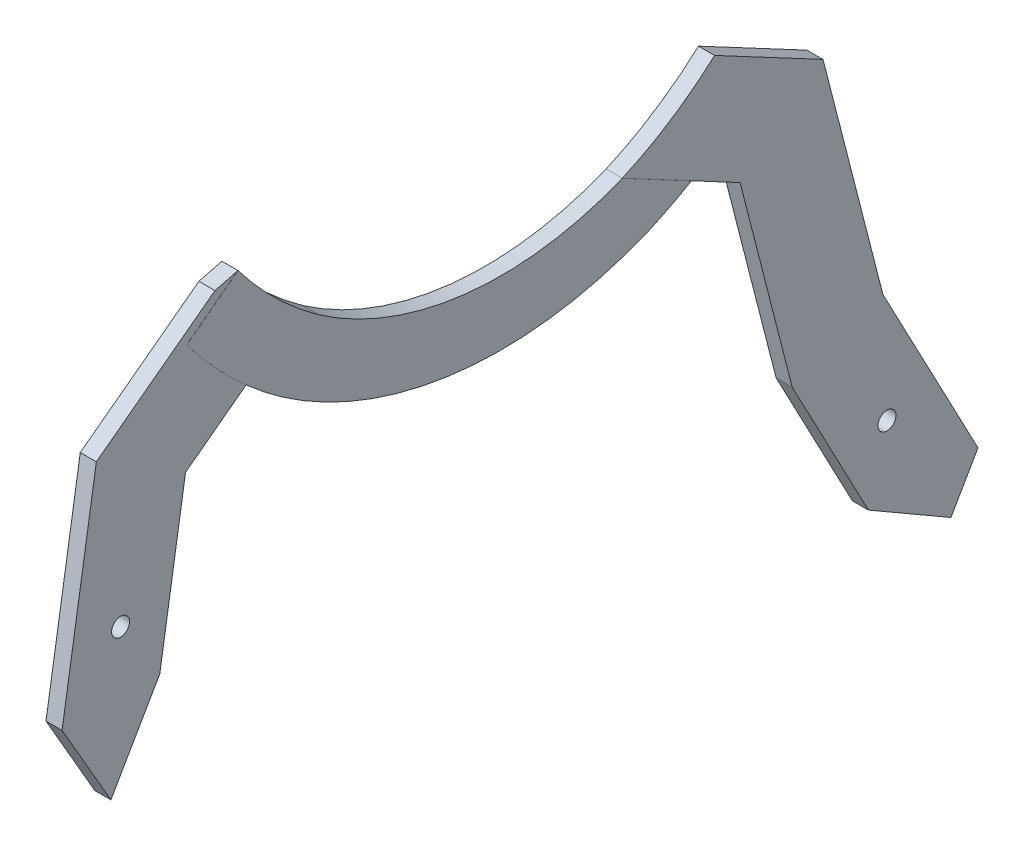
ISO-10303-21;
HEADER;
FILE_DESCRIPTION(('STEP AP214'),'2;1');
FILE_NAME('part.step','',(''),(''),'','','');
FILE_SCHEMA(('AUTOMOTIVE_DESIGN { 1 0 10303 214 1 1 1 1 }'));
ENDSEC;
DATA;
#1=APPLICATION_CONTEXT('core data for automotive mechanical design processes');
#2=APPLICATION_PROTOCOL_DEFINITION('international standard','automotive_design',2000,#1);
#3=PRODUCT_CONTEXT('',#1,'mechanical');
#4=PRODUCT('Part','Part','',(#3));
#5=PRODUCT_RELATED_PRODUCT_CATEGORY('part','',(#4));
#6=PRODUCT_DEFINITION_FORMATION('','',#4);
#7=PRODUCT_DEFINITION_CONTEXT('part definition',#1,'design');
#8=PRODUCT_DEFINITION('design','',#6,#7);
#9=PRODUCT_DEFINITION_SHAPE('','',#8);
#10=(LENGTH_UNIT() NAMED_UNIT(*) SI_UNIT(.MILLI.,.METRE.));
#11=(NAMED_UNIT(*) PLANE_ANGLE_UNIT() SI_UNIT($,.RADIAN.));
#12=(NAMED_UNIT(*) SI_UNIT($,.STERADIAN.) SOLID_ANGLE_UNIT());
#13=UNCERTAINTY_MEASURE_WITH_UNIT(LENGTH_MEASURE(1.E-05),#10,'distance_accuracy_value','');
#14=(GEOMETRIC_REPRESENTATION_CONTEXT(3) GLOBAL_UNCERTAINTY_ASSIGNED_CONTEXT((#13)) GLOBAL_UNIT_ASSIGNED_CONTEXT((#10,
#11,#12)) REPRESENTATION_CONTEXT('',''));
#15=CARTESIAN_POINT('',(0.,0.,0.));
#16=DIRECTION('',(0.,0.,1.));
#17=DIRECTION('',(1.,0.,0.));
#18=AXIS2_PLACEMENT_3D('',#15,#16,#17);
#19=CARTESIAN_POINT('',(-75.565,380.330006427415,-74.6248454772468));
#20=DIRECTION('',(0.,-0.466497855674576,0.884522329085605));
#21=DIRECTION('',(0.,0.884522329085605,0.466497855674576));
#22=AXIS2_PLACEMENT_3D('',#19,#20,#21);
#23=PLANE('',#22);
#24=DIRECTION('',(-1.,0.,0.));
#25=VECTOR('',#24,1.);
#26=CARTESIAN_POINT('',(-77.94625,380.595490592497,-74.4848288946752));
#27=LINE('',#26,#25);
#28=CARTESIAN_POINT('',(-76.35875,380.595490592497,-74.4848288946752));
#29=VERTEX_POINT('',#28);
#30=CARTESIAN_POINT('',(-79.53375,380.595490592497,-74.4848288946752));
#31=VERTEX_POINT('',#30);
#32=EDGE_CURVE('E11',#29,#31,#27,.T.);
#33=ORIENTED_EDGE('',*,*,#32,.T.);
#34=DIRECTION('',(0.,-0.884522329085605,-0.466497855674576));
#35=VECTOR('',#34,1.);
#36=CARTESIAN_POINT('',(-79.53375,343.459429906962,-94.0704200192228));
#37=LINE('',#36,#35);
#38=CARTESIAN_POINT('',(-79.53375,416.198358171535,-55.7078451653261));
#39=VERTEX_POINT('',#38);
#40=EDGE_CURVE('E25',#39,#31,#37,.T.);
#41=ORIENTED_EDGE('',*,*,#40,.F.);
#42=DIRECTION('',(-1.,0.,0.));
#43=VECTOR('',#42,1.);
#44=CARTESIAN_POINT('',(-75.565,416.198358171535,-55.7078451653261));
#45=LINE('',#44,#43);
#46=CARTESIAN_POINT('',(-76.35875,416.198358171535,-55.7078451653261));
#47=VERTEX_POINT('',#46);
#48=EDGE_CURVE('E512',#47,#39,#45,.T.);
#49=ORIENTED_EDGE('',*,*,#48,.F.);
#50=DIRECTION('',(0.,-0.884522329085605,-0.466497855674576));
#51=VECTOR('',#50,1.);
#52=CARTESIAN_POINT('',(-76.35875,343.459429906962,-94.0704200192228));
#53=LINE('',#52,#51);
#54=EDGE_CURVE('E508',#47,#29,#53,.T.);
#55=ORIENTED_EDGE('',*,*,#54,.T.);
#56=EDGE_LOOP('',(#33,#41,#49,#55));
#57=FACE_BOUND('',#56,.T.);
#58=ADVANCED_FACE('F17',(#57),#23,.F.);
#59=CARTESIAN_POINT('',(-75.565,416.198358171535,-55.7078451653261));
#60=DIRECTION('',(0.,-0.248375350267703,0.968663866044045));
#61=DIRECTION('',(0.,0.968663866044045,0.248375350267703));
#62=AXIS2_PLACEMENT_3D('',#59,#60,#61);
#63=PLANE('',#62);
#64=DIRECTION('',(0.,-0.968663866044045,-0.248375350267703));
#65=VECTOR('',#64,1.);
#66=CARTESIAN_POINT('',(-76.35875,343.58610343933,-74.3263720197377));
#67=LINE('',#66,#65);
#68=CARTESIAN_POINT('',(-76.35875,462.29314042173,-43.8886702293783));
#69=VERTEX_POINT('',#68);
#70=EDGE_CURVE('E503',#69,#47,#67,.T.);
#71=ORIENTED_EDGE('',*,*,#70,.T.);
#72=ORIENTED_EDGE('',*,*,#48,.T.);
#73=DIRECTION('',(0.,-0.968663866044045,-0.248375350267703));
#74=VECTOR('',#73,1.);
#75=CARTESIAN_POINT('',(-79.53375,343.58610343933,-74.3263720197377));
#76=LINE('',#75,#74);
#77=CARTESIAN_POINT('',(-79.53375,462.29314042173,-43.8886702293783));
#78=VERTEX_POINT('',#77);
#79=EDGE_CURVE('E498',#78,#39,#76,.T.);
#80=ORIENTED_EDGE('',*,*,#79,.F.);
#81=DIRECTION('',(-1.,0.,0.));
#82=VECTOR('',#81,1.);
#83=CARTESIAN_POINT('',(-75.565,462.29314042173,-43.8886702293783));
#84=LINE('',#83,#82);
#85=EDGE_CURVE('E495',#69,#78,#84,.T.);
#86=ORIENTED_EDGE('',*,*,#85,.F.);
#87=EDGE_LOOP('',(#71,#72,#80,#86));
#88=FACE_BOUND('',#87,.T.);
#89=ADVANCED_FACE('F524',(#88),#63,.F.);
#90=CARTESIAN_POINT('',(-75.565,462.29314042173,-43.8886702293783));
#91=DIRECTION('',(0.,-0.882970965785958,0.46942760206342));
#92=DIRECTION('',(0.,0.46942760206342,0.882970965785958));
#93=AXIS2_PLACEMENT_3D('',#90,#91,#92);
#94=PLANE('',#93);
#95=DIRECTION('',(1.,0.,0.));
#96=VECTOR('',#95,1.);
#97=CARTESIAN_POINT('',(-80.3275,473.66616999466,-22.4965431755355));
#98=LINE('',#97,#96);
#99=CARTESIAN_POINT('',(-79.53375,473.66616999466,-22.4965431755355));
#100=VERTEX_POINT('',#99);
#101=CARTESIAN_POINT('',(-76.35875,473.66616999466,-22.4965431755355));
#102=VERTEX_POINT('',#101);
#103=EDGE_CURVE('E491',#100,#102,#98,.T.);
#104=ORIENTED_EDGE('',*,*,#103,.T.);
#105=DIRECTION('',(0.,-0.46942760206342,-0.882970965785958));
#106=VECTOR('',#105,1.);
#107=CARTESIAN_POINT('',(-76.35875,447.404906403868,-71.8927294534514));
#108=LINE('',#107,#106);
#109=EDGE_CURVE('E486',#102,#69,#108,.T.);
#110=ORIENTED_EDGE('',*,*,#109,.T.);
#111=ORIENTED_EDGE('',*,*,#85,.T.);
#112=DIRECTION('',(0.,-0.46942760206342,-0.882970965785958));
#113=VECTOR('',#112,1.);
#114=CARTESIAN_POINT('',(-79.53375,447.404906403868,-71.8927294534514));
#115=LINE('',#114,#113);
#116=EDGE_CURVE('E481',#100,#78,#115,.T.);
#117=ORIENTED_EDGE('',*,*,#116,.F.);
#118=EDGE_LOOP('',(#104,#110,#111,#117));
#119=FACE_BOUND('',#118,.T.);
#120=ADVANCED_FACE('F526',(#119),#94,.F.);
#121=CARTESIAN_POINT('',(-75.565,449.418698704968,-27.5235444258966));
#122=DIRECTION('',(0.,0.248375350267703,-0.968663866044045));
#123=DIRECTION('',(0.,-0.968663866044045,-0.248375350267703));
#124=AXIS2_PLACEMENT_3D('',#121,#122,#123);
#125=PLANE('',#124);
#126=DIRECTION('',(0.,0.968663866044045,0.248375350267703));
#127=VECTOR('',#126,1.);
#128=CARTESIAN_POINT('',(-76.35875,357.830498494747,-51.0076983259533));
#129=LINE('',#128,#127);
#130=CARTESIAN_POINT('',(-76.35875,409.294859361956,-37.811708360002));
#131=VERTEX_POINT('',#130);
#132=CARTESIAN_POINT('',(-76.35875,449.418698704969,-27.5235444258966));
#133=VERTEX_POINT('',#132);
#134=EDGE_CURVE('E479',#131,#133,#129,.T.);
#135=ORIENTED_EDGE('',*,*,#134,.T.);
#136=DIRECTION('',(-1.,0.,0.));
#137=VECTOR('',#136,1.);
#138=CARTESIAN_POINT('',(-75.565,449.418698704969,-27.5235444258963));
#139=LINE('',#138,#137);
#140=CARTESIAN_POINT('',(-79.53375,449.418698704969,-27.5235444258966));
#141=VERTEX_POINT('',#140);
#142=EDGE_CURVE('E475',#133,#141,#139,.T.);
#143=ORIENTED_EDGE('',*,*,#142,.T.);
#144=DIRECTION('',(0.,0.968663866044045,0.248375350267703));
#145=VECTOR('',#144,1.);
#146=CARTESIAN_POINT('',(-79.53375,357.830498494747,-51.0076983259533));
#147=LINE('',#146,#145);
#148=CARTESIAN_POINT('',(-79.53375,409.294859361956,-37.811708360002));
#149=VERTEX_POINT('',#148);
#150=EDGE_CURVE('E470',#149,#141,#147,.T.);
#151=ORIENTED_EDGE('',*,*,#150,.F.);
#152=DIRECTION('',(-1.,0.,0.));
#153=VECTOR('',#152,1.);
#154=CARTESIAN_POINT('',(-75.565,409.294859361956,-37.811708360002));
#155=LINE('',#154,#153);
#156=EDGE_CURVE('E467',#131,#149,#155,.T.);
#157=ORIENTED_EDGE('',*,*,#156,.F.);
#158=EDGE_LOOP('',(#135,#143,#151,#157));
#159=FACE_BOUND('',#158,.T.);
#160=ADVANCED_FACE('F540',(#159),#125,.F.);
#161=CARTESIAN_POINT('',(-80.3275,461.788051168098,-4.25738145953423));
#162=DIRECTION('',(0.,-0.882970965785958,0.469427602063421));
#163=DIRECTION('',(0.,-0.469427602063421,-0.882970965785958));
#164=AXIS2_PLACEMENT_3D('',#161,#162,#163);
#165=PLANE('',#164);
#166=DIRECTION('',(-1.,0.,0.));
#167=VECTOR('',#166,1.);
#168=CARTESIAN_POINT('',(-79.53375,454.539997206701,-17.890625815496));
#169=LINE('',#168,#167);
#170=CARTESIAN_POINT('',(-79.53375,454.539997206701,-17.890625815496));
#171=VERTEX_POINT('',#170);
#172=CARTESIAN_POINT('',(-76.35875,454.539997206701,-17.890625815496));
#173=VERTEX_POINT('',#172);
#174=EDGE_CURVE('E464',#171,#173,#169,.F.);
#175=ORIENTED_EDGE('',*,*,#174,.F.);
#176=DIRECTION('',(0.,0.469427602063421,0.882970965785958));
#177=VECTOR('',#176,1.);
#178=CARTESIAN_POINT('',(-79.53375,415.696075487786,-90.9541928582169));
#179=LINE('',#178,#177);
#180=EDGE_CURVE('E461',#141,#171,#179,.T.);
#181=ORIENTED_EDGE('',*,*,#180,.F.);
#182=ORIENTED_EDGE('',*,*,#142,.F.);
#183=DIRECTION('',(0.,0.469427602063421,0.882970965785958));
#184=VECTOR('',#183,1.);
#185=CARTESIAN_POINT('',(-76.35875,461.788051168098,-4.25738145953423));
#186=LINE('',#185,#184);
#187=EDGE_CURVE('E459',#133,#173,#186,.T.);
#188=ORIENTED_EDGE('',*,*,#187,.T.);
#189=EDGE_LOOP('',(#175,#181,#182,#188));
#190=FACE_BOUND('',#189,.T.);
#191=ADVANCED_FACE('F545',(#190),#165,.T.);
#192=CARTESIAN_POINT('',(-75.565,454.60893271406,81.9454309182516));
#193=DIRECTION('',(0.,0.8,0.6));
#194=DIRECTION('',(0.,0.6,-0.8));
#195=AXIS2_PLACEMENT_3D('',#192,#193,#194);
#196=PLANE('',#195);
#197=DIRECTION('',(-1.,0.,0.));
#198=VECTOR('',#197,1.);
#199=CARTESIAN_POINT('',(-77.94625,463.582552167806,69.9806049799257));
#200=LINE('',#199,#198);
#201=CARTESIAN_POINT('',(-76.35875,463.582552167804,69.9806049799257));
#202=VERTEX_POINT('',#201);
#203=CARTESIAN_POINT('',(-79.53375,463.582552167806,69.9806049799257));
#204=VERTEX_POINT('',#203);
#205=EDGE_CURVE('E454',#202,#204,#200,.T.);
#206=ORIENTED_EDGE('',*,*,#205,.F.);
#207=DIRECTION('',(0.,-0.6,0.8));
#208=VECTOR('',#207,1.);
#209=CARTESIAN_POINT('',(-76.35875,437.376741617652,104.921685713463));
#210=LINE('',#209,#208);
#211=CARTESIAN_POINT('',(-76.35875,454.60893271406,81.9454309182516));
#212=VERTEX_POINT('',#211);
#213=EDGE_CURVE('E450',#202,#212,#210,.T.);
#214=ORIENTED_EDGE('',*,*,#213,.T.);
#215=DIRECTION('',(-1.,0.,0.));
#216=VECTOR('',#215,1.);
#217=CARTESIAN_POINT('',(-75.565,454.60893271406,81.9454309182516));
#218=LINE('',#217,#216);
#219=CARTESIAN_POINT('',(-79.53375,454.60893271406,81.9454309182516));
#220=VERTEX_POINT('',#219);
#221=EDGE_CURVE('E446',#212,#220,#218,.T.);
#222=ORIENTED_EDGE('',*,*,#221,.T.);
#223=DIRECTION('',(0.,-0.6,0.8));
#224=VECTOR('',#223,1.);
#225=CARTESIAN_POINT('',(-79.53375,437.376741617652,104.921685713463));
#226=LINE('',#225,#224);
#227=EDGE_CURVE('E441',#204,#220,#226,.T.);
#228=ORIENTED_EDGE('',*,*,#227,.F.);
#229=EDGE_LOOP('',(#206,#214,#222,#228));
#230=FACE_BOUND('',#229,.T.);
#231=ADVANCED_FACE('F549',(#230),#196,.F.);
#232=CARTESIAN_POINT('',(-75.565,422.021054844437,87.1298660338732));
#233=DIRECTION('',(0.,0.157115048735132,0.987580306335114));
#234=DIRECTION('',(0.,0.987580306335114,-0.157115048735132));
#235=AXIS2_PLACEMENT_3D('',#232,#233,#234);
#236=PLANE('',#235);
#237=DIRECTION('',(-1.,0.,0.));
#238=VECTOR('',#237,1.);
#239=CARTESIAN_POINT('',(-77.94625,422.722279884994,87.0183075046938));
#240=LINE('',#239,#238);
#241=CARTESIAN_POINT('',(-76.35875,422.722279884994,87.0183075046938));
#242=VERTEX_POINT('',#241);
#243=CARTESIAN_POINT('',(-79.53375,422.722279884994,87.0183075046938));
#244=VERTEX_POINT('',#243);
#245=EDGE_CURVE('E437',#242,#244,#240,.T.);
#246=ORIENTED_EDGE('',*,*,#245,.T.);
#247=DIRECTION('',(0.,-0.987580306335114,0.157115048735132));
#248=VECTOR('',#247,1.);
#249=CARTESIAN_POINT('',(-79.53375,343.814684397125,99.5717886050369));
#250=LINE('',#249,#248);
#251=EDGE_CURVE('E432',#220,#244,#250,.T.);
#252=ORIENTED_EDGE('',*,*,#251,.F.);
#253=ORIENTED_EDGE('',*,*,#221,.F.);
#254=DIRECTION('',(0.,-0.987580306335114,0.157115048735132));
#255=VECTOR('',#254,1.);
#256=CARTESIAN_POINT('',(-76.35875,343.814684397125,99.5717886050369));
#257=LINE('',#256,#255);
#258=EDGE_CURVE('E428',#212,#242,#257,.T.);
#259=ORIENTED_EDGE('',*,*,#258,.T.);
#260=EDGE_LOOP('',(#246,#252,#253,#259));
#261=FACE_BOUND('',#260,.T.);
#262=ADVANCED_FACE('F553',(#261),#236,.F.);
#263=CARTESIAN_POINT('',(-75.565,482.78392392031,76.128775976585));
#264=DIRECTION('',(0.,-0.8,-0.6));
#265=DIRECTION('',(0.,-0.6,0.8));
#266=AXIS2_PLACEMENT_3D('',#263,#264,#265);
#267=PLANE('',#266);
#268=DIRECTION('',(0.,0.6,-0.8));
#269=VECTOR('',#268,1.);
#270=CARTESIAN_POINT('',(-76.35875,459.084237220776,107.728358242629));
#271=LINE('',#270,#269);
#272=CARTESIAN_POINT('',(-76.35875,465.220395207242,99.5468142606754));
#273=VERTEX_POINT('',#272);
#274=CARTESIAN_POINT('',(-76.35875,482.78392392031,76.128775976585));
#275=VERTEX_POINT('',#274);
#276=EDGE_CURVE('E424',#273,#275,#271,.T.);
#277=ORIENTED_EDGE('',*,*,#276,.T.);
#278=DIRECTION('',(-1.,0.,0.));
#279=VECTOR('',#278,1.);
#280=CARTESIAN_POINT('',(-75.565,482.78392392031,76.128775976585));
#281=LINE('',#280,#279);
#282=CARTESIAN_POINT('',(-79.53375,482.78392392031,76.128775976585));
#283=VERTEX_POINT('',#282);
#284=EDGE_CURVE('E420',#275,#283,#281,.T.);
#285=ORIENTED_EDGE('',*,*,#284,.T.);
#286=DIRECTION('',(0.,0.6,-0.8));
#287=VECTOR('',#286,1.);
#288=CARTESIAN_POINT('',(-79.53375,459.084237220776,107.728358242629));
#289=LINE('',#288,#287);
#290=CARTESIAN_POINT('',(-79.53375,465.220395207242,99.5468142606754));
#291=VERTEX_POINT('',#290);
#292=EDGE_CURVE('E415',#291,#283,#289,.T.);
#293=ORIENTED_EDGE('',*,*,#292,.F.);
#294=DIRECTION('',(-1.,0.,0.));
#295=VECTOR('',#294,1.);
#296=CARTESIAN_POINT('',(-75.565,465.220395207242,99.5468142606754));
#297=LINE('',#296,#295);
#298=EDGE_CURVE('E412',#273,#291,#297,.T.);
#299=ORIENTED_EDGE('',*,*,#298,.F.);
#300=EDGE_LOOP('',(#277,#285,#293,#299));
#301=FACE_BOUND('',#300,.T.);
#302=ADVANCED_FACE('F556',(#301),#267,.F.);
#303=CARTESIAN_POINT('',(-75.565,492.541439872016,38.0744637649379));
#304=DIRECTION('',(0.,-0.968663866044045,-0.248375350267703));
#305=DIRECTION('',(0.,-0.248375350267703,0.968663866044045));
#306=AXIS2_PLACEMENT_3D('',#303,#304,#305);
#307=PLANE('',#306);
#308=DIRECTION('',(1.,0.,0.));
#309=VECTOR('',#308,1.);
#310=CARTESIAN_POINT('',(-77.94625,483.946867048163,71.593297777957));
#311=LINE('',#310,#309);
#312=CARTESIAN_POINT('',(-79.53375,483.946867048163,71.593297777957));
#313=VERTEX_POINT('',#312);
#314=CARTESIAN_POINT('',(-76.35875,483.946867048163,71.593297777957));
#315=VERTEX_POINT('',#314);
#316=EDGE_CURVE('E407',#313,#315,#311,.T.);
#317=ORIENTED_EDGE('',*,*,#316,.F.);
#318=DIRECTION('',(0.,0.248375350267703,-0.968663866044045));
#319=VECTOR('',#318,1.);
#320=CARTESIAN_POINT('',(-79.53375,489.751626226201,48.9547369836099));
#321=LINE('',#320,#319);
#322=EDGE_CURVE('E402',#283,#313,#321,.T.);
#323=ORIENTED_EDGE('',*,*,#322,.F.);
#324=ORIENTED_EDGE('',*,*,#284,.F.);
#325=DIRECTION('',(0.,0.248375350267703,-0.968663866044045));
#326=VECTOR('',#325,1.);
#327=CARTESIAN_POINT('',(-76.35875,489.751626226201,48.9547369836099));
#328=LINE('',#327,#326);
#329=EDGE_CURVE('E397',#275,#315,#328,.T.);
#330=ORIENTED_EDGE('',*,*,#329,.T.);
#331=EDGE_LOOP('',(#317,#323,#324,#330));
#332=FACE_BOUND('',#331,.T.);
#333=ADVANCED_FACE('F385',(#332),#307,.F.);
#334=CARTESIAN_POINT('',(-77.9399,485.7846605664,72.9431369138196));
#335=CARTESIAN_POINT('',(-77.9399,485.168124967971,72.5017780634378));
#336=CARTESIAN_POINT('',(-77.9399,483.834957249054,71.52556548488));
#337=CARTESIAN_POINT('',(-77.9399,482.524862749399,70.499034458407));
#338=CARTESIAN_POINT('',(-77.9399,478.601777690667,67.3103331197016));
#339=CARTESIAN_POINT('',(-77.9399,475.605853694521,64.4078102372085));
#340=CARTESIAN_POINT('',(-77.9399,471.558345419543,59.8270121387103));
#341=CARTESIAN_POINT('',(-77.9399,469.967398562238,57.846090504835));
#342=CARTESIAN_POINT('',(-77.9399,468.457685756499,55.7235885803632));
#343=CARTESIAN_POINT('',(-77.9399,467.974015107426,55.0414355673766));
#344=CARTESIAN_POINT('',(-77.9399,467.503228299838,54.3510108914568));
#345=CARTESIAN_POINT('',(-77.9399,467.078413755405,53.7124649126291));
#346=B_SPLINE_CURVE_WITH_KNOTS('',3,(#334,#335,#336,#337,#338,#339,#340,#341,#342,#343,#344,
#345),.UNSPECIFIED.,.F.,.F.,(4,1,2,2,2,1,4),(3.40333921481556,3.61325356187763,3.8598150947554,
5.00016036189,5.6936479936227,5.71239703249832,5.92231137956039),.UNSPECIFIED.);
#347=DIRECTION('',(-1.,0.,0.));
#348=VECTOR('',#347,1.);
#349=SURFACE_OF_LINEAR_EXTRUSION('',#346,#348);
#350=CARTESIAN_POINT('',(-76.34605,468.378456136614,55.6116679826577));
#351=CARTESIAN_POINT('',(-76.34605,468.418027637359,55.6676560868109));
#352=CARTESIAN_POINT('',(-76.34605,468.457685756499,55.7235885803632));
#353=CARTESIAN_POINT('',(-76.34605,468.497427692366,55.7794616808896));
#354=CARTESIAN_POINT('',(-76.34605,469.967398562238,57.846090504835));
#355=CARTESIAN_POINT('',(-76.34605,471.558345419543,59.8270121387103));
#356=CARTESIAN_POINT('',(-76.34605,473.088963029122,61.5593001932738));
#357=CARTESIAN_POINT('',(-76.34605,475.605853694521,64.4078102372085));
#358=CARTESIAN_POINT('',(-76.34605,478.601777690667,67.3103331197016));
#359=CARTESIAN_POINT('',(-76.34605,481.827424489175,69.9321534755223));
#360=CARTESIAN_POINT('',(-76.34605,482.524862749399,70.499034458407));
#361=CARTESIAN_POINT('',(-76.34605,483.232499061075,71.0535063912222));
#362=CARTESIAN_POINT('',(-76.34605,483.946867048163,71.593297777957));
#363=B_SPLINE_CURVE_WITH_KNOTS('',3,(#350,#351,#352,#353,#354,#355,#356,#357,#358,#359,#360,
#361,#362),.UNSPECIFIED.,.F.,.F.,(4,3,3,3,4),(-2.30871021821156,-2.28808938012232,
-1.5253678205944,-0.271176857770708,0.),.UNSPECIFIED.);
#364=CARTESIAN_POINT('',(-76.34605,468.378456136614,55.6116679826577));
#365=VERTEX_POINT('',#364);
#366=CARTESIAN_POINT('',(-76.34605,483.946867048163,71.593297777957));
#367=VERTEX_POINT('',#366);
#368=EDGE_CURVE('E393',#365,#367,#363,.T.);
#369=ORIENTED_EDGE('',*,*,#368,.F.);
#370=DIRECTION('',(1.,0.,0.));
#371=VECTOR('',#370,1.);
#372=CARTESIAN_POINT('',(-80.3275,468.378456136614,55.6116679826577));
#373=LINE('',#372,#371);
#374=CARTESIAN_POINT('',(-79.53375,468.378456136614,55.6116679826577));
#375=VERTEX_POINT('',#374);
#376=EDGE_CURVE('E583',#375,#365,#373,.T.);
#377=ORIENTED_EDGE('',*,*,#376,.F.);
#378=CARTESIAN_POINT('',(-79.53375,468.378456136614,55.6116679826577));
#379=CARTESIAN_POINT('',(-79.53375,468.418027637359,55.6676560868109));
#380=CARTESIAN_POINT('',(-79.53375,468.457685756499,55.7235885803632));
#381=CARTESIAN_POINT('',(-79.53375,468.497427692366,55.7794616808896));
#382=CARTESIAN_POINT('',(-79.53375,469.967398562238,57.846090504835));
#383=CARTESIAN_POINT('',(-79.53375,471.558345419543,59.8270121387103));
#384=CARTESIAN_POINT('',(-79.53375,473.088963029122,61.5593001932738));
#385=CARTESIAN_POINT('',(-79.53375,475.605853694521,64.4078102372085));
#386=CARTESIAN_POINT('',(-79.53375,478.601777690667,67.3103331197016));
#387=CARTESIAN_POINT('',(-79.53375,481.827424489175,69.9321534755223));
#388=CARTESIAN_POINT('',(-79.53375,482.524862749399,70.499034458407));
#389=CARTESIAN_POINT('',(-79.53375,483.232499061075,71.0535063912222));
#390=CARTESIAN_POINT('',(-79.53375,483.946867048163,71.593297777957));
#391=B_SPLINE_CURVE_WITH_KNOTS('',3,(#378,#379,#380,#381,#382,#383,#384,#385,#386,#387,#388,
#389,#390),.UNSPECIFIED.,.F.,.F.,(4,3,3,3,4),(-2.30871021821156,-2.28808938012232,
-1.5253678205944,-0.271176857770708,0.),.UNSPECIFIED.);
#392=EDGE_CURVE('E579',#375,#313,#391,.T.);
#393=ORIENTED_EDGE('',*,*,#392,.T.);
#394=ORIENTED_EDGE('',*,*,#316,.T.);
#395=DIRECTION('',(1.,0.,0.));
#396=VECTOR('',#395,1.);
#397=CARTESIAN_POINT('',(-80.3275,483.946867048163,71.593297777957));
#398=LINE('',#397,#396);
#399=EDGE_CURVE('E575',#315,#367,#398,.T.);
#400=ORIENTED_EDGE('',*,*,#399,.T.);
#401=EDGE_LOOP('',(#369,#377,#393,#394,#400));
#402=FACE_BOUND('',#401,.T.);
#403=ADVANCED_FACE('F380',(#402),#349,.T.);
#404=CARTESIAN_POINT('',(-76.34605,464.166808570112,31.917542042521));
#405=DIRECTION('',(1.,0.,0.));
#406=DIRECTION('',(0.,0.,-1.));
#407=AXIS2_PLACEMENT_3D('',#404,#405,#406);
#408=PLANE('',#407);
#409=CARTESIAN_POINT('',(-76.34605,520.085344422969,19.622494729962));
#410=DIRECTION('',(-1.,0.,0.));
#411=DIRECTION('',(0.,-0.820400900912857,0.571788738767539));
#412=AXIS2_PLACEMENT_3D('',#409,#410,#411);
#413=CIRCLE('',#412,75.6985943309073);
#414=CARTESIAN_POINT('',(-76.34605,450.094405943313,-9.21429709161576));
#415=VERTEX_POINT('',#414);
#416=CARTESIAN_POINT('',(-76.34605,457.982149436054,62.906098508907));
#417=VERTEX_POINT('',#416);
#418=EDGE_CURVE('E580',#415,#417,#413,.T.);
#419=ORIENTED_EDGE('',*,*,#418,.F.);
#420=CARTESIAN_POINT('',(-76.34605,521.23002381018,21.7580783929287));
#421=DIRECTION('',(-1.,0.,0.));
#422=DIRECTION('',(0.,0.,1.));
#423=AXIS2_PLACEMENT_3D('',#420,#421,#422);
#424=CIRCLE('',#423,77.585948429983);
#425=CARTESIAN_POINT('',(-76.34605,454.5399972067,-17.8906258154956));
#426=VERTEX_POINT('',#425);
#427=EDGE_CURVE('E586',#426,#415,#424,.T.);
#428=ORIENTED_EDGE('',*,*,#427,.F.);
#429=DIRECTION('',(0.,-0.469427602063421,-0.882970965785958));
#430=VECTOR('',#429,1.);
#431=CARTESIAN_POINT('',(-76.34605,469.547234443361,10.337272796319));
#432=LINE('',#431,#430);
#433=CARTESIAN_POINT('',(-76.34605,461.788051168098,-4.25738145953423));
#434=VERTEX_POINT('',#433);
#435=EDGE_CURVE('E686',#434,#426,#432,.T.);
#436=ORIENTED_EDGE('',*,*,#435,.F.);
#437=CARTESIAN_POINT('',(-76.34605,520.085344422969,19.622494729962));
#438=DIRECTION('',(1.,0.,0.));
#439=DIRECTION('',(0.,-0.82076257153864,0.571269464579789));
#440=AXIS2_PLACEMENT_3D('',#437,#438,#439);
#441=CIRCLE('',#440,62.9985943309058);
#442=EDGE_CURVE('E601',#365,#434,#441,.T.);
#443=ORIENTED_EDGE('',*,*,#442,.F.);
#444=ORIENTED_EDGE('',*,*,#368,.T.);
#445=DIRECTION('',(0.,0.602866280959936,-0.797842244608253));
#446=VECTOR('',#445,1.);
#447=CARTESIAN_POINT('',(-76.34605,486.066021519884,68.7887770844188));
#448=LINE('',#447,#446);
#449=CARTESIAN_POINT('',(-76.34605,476.290465279974,81.7258942844817));
#450=VERTEX_POINT('',#449);
#451=EDGE_CURVE('E577',#450,#367,#448,.T.);
#452=ORIENTED_EDGE('',*,*,#451,.F.);
#453=CARTESIAN_POINT('',(-76.34605,457.982149436054,62.906098508907));
#454=CARTESIAN_POINT('',(-76.34605,457.990556999322,62.9179940276274));
#455=CARTESIAN_POINT('',(-76.34605,457.998964562591,62.9298895463487));
#456=CARTESIAN_POINT('',(-76.34605,458.00737212586,62.9417850650704));
#457=CARTESIAN_POINT('',(-76.34605,458.054273054796,63.0081432785496));
#458=CARTESIAN_POINT('',(-76.34605,458.101271440471,63.0744282210678));
#459=CARTESIAN_POINT('',(-76.34605,458.148365843894,63.1406381396162));
#460=CARTESIAN_POINT('',(-76.34605,459.90522501308,65.6106025947414));
#461=CARTESIAN_POINT('',(-76.34605,461.751591219502,67.9084034963575));
#462=CARTESIAN_POINT('',(-76.34605,463.571825035766,69.9684668829878));
#463=CARTESIAN_POINT('',(-76.34605,466.565407130543,73.3564760569856));
#464=CARTESIAN_POINT('',(-76.34605,470.018136450971,76.6995251950523));
#465=CARTESIAN_POINT('',(-76.34605,473.81709045748,79.7873322512043));
#466=CARTESIAN_POINT('',(-76.34605,474.631942467125,80.4496476624449));
#467=CARTESIAN_POINT('',(-76.34605,475.457114155577,81.0961967515508));
#468=CARTESIAN_POINT('',(-76.34605,476.290465279974,81.7258942844817));
#469=B_SPLINE_CURVE_WITH_KNOTS('',3,(#453,#454,#455,#456,#457,#458,#459,#460,#461,#462,#463,
#464,#465,#466,#467,#468),.UNSPECIFIED.,.F.,.F.,(4,3,3,3,3,4),(-3.02193420143933,
-3.01621037916708,-2.98927032173532,-1.99281408997632,-0.354278525969158,0.),.UNSPECIFIED.);
#470=EDGE_CURVE('E693',#417,#450,#469,.T.);
#471=ORIENTED_EDGE('',*,*,#470,.F.);
#472=EDGE_LOOP('',(#419,#428,#436,#443,#444,#452,#471));
#473=FACE_BOUND('',#472,.T.);
#474=ADVANCED_FACE('F376',(#473),#408,.T.);
#475=CARTESIAN_POINT('',(-80.3275,520.085344422969,19.622494729962));
#476=DIRECTION('',(-1.,0.,0.));
#477=DIRECTION('',(0.,-0.820400900912857,0.571788738767539));
#478=AXIS2_PLACEMENT_3D('',#475,#476,#477);
#479=CYLINDRICAL_SURFACE('',#478,75.6985943309073);
#480=CARTESIAN_POINT('',(-79.53375,520.085344422969,19.622494729962));
#481=DIRECTION('',(-1.,0.,0.));
#482=DIRECTION('',(0.,-0.820400900912857,0.571788738767539));
#483=AXIS2_PLACEMENT_3D('',#480,#481,#482);
#484=CIRCLE('',#483,75.6985943309073);
#485=CARTESIAN_POINT('',(-79.53374975,450.09440594331,-9.21429709161695));
#486=VERTEX_POINT('',#485);
#487=CARTESIAN_POINT('',(-79.53375,457.982149436054,62.906098508907));
#488=VERTEX_POINT('',#487);
#489=EDGE_CURVE('E691',#486,#488,#484,.T.);
#490=ORIENTED_EDGE('',*,*,#489,.F.);
#491=CARTESIAN_POINT('',(-79.53374975,450.094495881516,-9.21425793261423));
#492=DIRECTION('',(1.,0.,0.));
#493=VECTOR('',#492,1.);
#494=LINE('',#491,#493);
#495=EDGE_CURVE('E339',#486,#415,#494,.T.);
#496=ORIENTED_EDGE('',*,*,#495,.T.);
#497=ORIENTED_EDGE('',*,*,#418,.T.);
#498=DIRECTION('',(1.,0.,0.));
#499=VECTOR('',#498,1.);
#500=CARTESIAN_POINT('',(-80.3275,457.982149436054,62.906098508907));
#501=LINE('',#500,#499);
#502=EDGE_CURVE('E358',#488,#417,#501,.T.);
#503=ORIENTED_EDGE('',*,*,#502,.F.);
#504=EDGE_LOOP('',(#490,#496,#497,#503));
#505=FACE_BOUND('',#504,.T.);
#506=ADVANCED_FACE('F366',(#505),#479,.T.);
#507=CARTESIAN_POINT('',(-80.3275,520.085344422969,19.622494729962));
#508=DIRECTION('',(-1.,0.,0.));
#509=DIRECTION('',(0.,-0.82076257153864,0.571269464579789));
#510=AXIS2_PLACEMENT_3D('',#507,#508,#509);
#511=CYLINDRICAL_SURFACE('',#510,62.9985943309058);
#512=DIRECTION('',(1.,0.,0.));
#513=VECTOR('',#512,1.);
#514=CARTESIAN_POINT('',(-80.3275,461.788051168098,-4.25738145953423));
#515=LINE('',#514,#513);
#516=CARTESIAN_POINT('',(-79.53375,461.788051168098,-4.25738145953425));
#517=VERTEX_POINT('',#516);
#518=CARTESIAN_POINT('',(-76.35875,461.788051168098,-4.25738145953425));
#519=VERTEX_POINT('',#518);
#520=EDGE_CURVE('E355',#517,#519,#515,.T.);
#521=ORIENTED_EDGE('',*,*,#520,.F.);
#522=CARTESIAN_POINT('',(-79.53375,520.085344422969,19.622494729962));
#523=DIRECTION('',(1.,0.,0.));
#524=DIRECTION('',(0.,-0.82076257153864,0.571269464579789));
#525=AXIS2_PLACEMENT_3D('',#522,#523,#524);
#526=CIRCLE('',#525,62.9985943309058);
#527=EDGE_CURVE('E350',#375,#517,#526,.T.);
#528=ORIENTED_EDGE('',*,*,#527,.F.);
#529=ORIENTED_EDGE('',*,*,#376,.T.);
#530=ORIENTED_EDGE('',*,*,#442,.T.);
#531=DIRECTION('',(1.,0.,0.));
#532=VECTOR('',#531,1.);
#533=CARTESIAN_POINT('',(-80.3275,461.788051168098,-4.25738145953423));
#534=LINE('',#533,#532);
#535=EDGE_CURVE('E347',#519,#434,#534,.T.);
#536=ORIENTED_EDGE('',*,*,#535,.F.);
#537=EDGE_LOOP('',(#521,#528,#529,#530,#536));
#538=FACE_BOUND('',#537,.T.);
#539=ADVANCED_FACE('F375',(#538),#511,.F.);
#540=CARTESIAN_POINT('',(-80.3275,461.788051168098,-4.25738145953423));
#541=DIRECTION('',(0.,-0.882970965785958,0.469427602063421));
#542=DIRECTION('',(0.,-0.469427602063421,-0.882970965785958));
#543=AXIS2_PLACEMENT_3D('',#540,#541,#542);
#544=PLANE('',#543);
#545=ORIENTED_EDGE('',*,*,#535,.T.);
#546=ORIENTED_EDGE('',*,*,#435,.T.);
#547=DIRECTION('',(-1.,0.,0.));
#548=VECTOR('',#547,1.);
#549=CARTESIAN_POINT('',(-76.35875,454.539997206701,-17.890625815496));
#550=LINE('',#549,#548);
#551=EDGE_CURVE('E344',#173,#426,#550,.F.);
#552=ORIENTED_EDGE('',*,*,#551,.F.);
#553=DIRECTION('',(0.,-0.469427602063421,-0.882970965785958));
#554=VECTOR('',#553,1.);
#555=CARTESIAN_POINT('',(-76.35875,438.742063327941,-47.6057871588753));
#556=LINE('',#555,#554);
#557=EDGE_CURVE('E341',#519,#173,#556,.T.);
#558=ORIENTED_EDGE('',*,*,#557,.F.);
#559=EDGE_LOOP('',(#545,#546,#552,#558));
#560=FACE_BOUND('',#559,.T.);
#561=ADVANCED_FACE('F321',(#560),#544,.F.);
#562=CARTESIAN_POINT('',(-77.9399000000031,521.23002381018,21.7580783929287));
#563=DIRECTION('',(-1.,0.,0.));
#564=DIRECTION('',(0.,-0.889680118129603,-0.456584370521917));
#565=AXIS2_PLACEMENT_3D('',#562,#563,#564);
#566=CYLINDRICAL_SURFACE('',#565,77.585948429983);
#567=ORIENTED_EDGE('',*,*,#551,.T.);
#568=ORIENTED_EDGE('',*,*,#427,.T.);
#569=ORIENTED_EDGE('',*,*,#495,.F.);
#570=CARTESIAN_POINT('',(-79.53375,521.23002381018,21.7580783929287));
#571=DIRECTION('',(-1.,0.,0.));
#572=DIRECTION('',(0.,0.,1.));
#573=AXIS2_PLACEMENT_3D('',#570,#571,#572);
#574=CIRCLE('',#573,77.585948429983);
#575=EDGE_CURVE('E297',#171,#486,#574,.T.);
#576=ORIENTED_EDGE('',*,*,#575,.F.);
#577=ORIENTED_EDGE('',*,*,#174,.T.);
#578=EDGE_LOOP('',(#567,#568,#569,#576,#577));
#579=FACE_BOUND('',#578,.T.);
#580=ADVANCED_FACE('F315',(#579),#566,.T.);
#581=CARTESIAN_POINT('',(-77.9399,478.439099155958,83.3040220464064));
#582=CARTESIAN_POINT('',(-77.9399,477.718084495182,82.787875525208));
#583=CARTESIAN_POINT('',(-77.9399,476.160971252355,81.6476918781419));
#584=CARTESIAN_POINT('',(-77.9399,474.631942467125,80.4496476624449));
#585=CARTESIAN_POINT('',(-77.9399,473.81709045748,79.7873322512043));
#586=CARTESIAN_POINT('',(-77.9399,470.018136450971,76.6995251950523));
#587=CARTESIAN_POINT('',(-77.9399,466.565407130543,73.3564760569856));
#588=CARTESIAN_POINT('',(-77.9399,463.571825035766,69.9684668829878));
#589=CARTESIAN_POINT('',(-77.9399,461.751591219502,67.9084034963575));
#590=CARTESIAN_POINT('',(-77.9399,459.90522501308,65.6106025947414));
#591=CARTESIAN_POINT('',(-77.9399,458.148365843894,63.1406381396162));
#592=CARTESIAN_POINT('',(-77.9399,458.101271440471,63.0744282210678));
#593=CARTESIAN_POINT('',(-77.9399,458.054273054796,63.0081432785496));
#594=CARTESIAN_POINT('',(-77.9399,458.00737212586,62.9417850650704));
#595=CARTESIAN_POINT('',(-77.9399,457.998964562591,62.9298895463487));
#596=CARTESIAN_POINT('',(-77.9399,457.990556999322,62.9179940276274));
#597=CARTESIAN_POINT('',(-77.9399,457.982149436054,62.906098508907));
#598=CARTESIAN_POINT('',(-77.9399,457.538265929861,62.27806582104));
#599=CARTESIAN_POINT('',(-77.9399,457.094382423668,61.650033133173));
#600=CARTESIAN_POINT('',(-77.9399,456.650498917476,61.022000445306));
#601=B_SPLINE_CURVE_WITH_KNOTS('',3,(#581,#582,#583,#584,#585,#586,#587,#588,#589,#590,#591,
#592,#593,#594,#595,#596,#597,#598,#599,#600),.UNSPECIFIED.,.F.,.F.,(4,1,3,3,3,3,3,4),
(3.3989573465427,3.60927004526594,3.85583157814371,4.99617684527831,5.68966447701101,
5.70841351588663,5.71239703249832,5.92270973122156),.UNSPECIFIED.);
#602=DIRECTION('',(-1.,0.,0.));
#603=VECTOR('',#602,1.);
#604=SURFACE_OF_LINEAR_EXTRUSION('',#601,#603);
#605=ORIENTED_EDGE('',*,*,#205,.T.);
#606=CARTESIAN_POINT('',(-79.53375,457.982149436054,62.906098508907));
#607=CARTESIAN_POINT('',(-79.53375,457.990556999322,62.9179940276274));
#608=CARTESIAN_POINT('',(-79.53375,457.998964562591,62.9298895463487));
#609=CARTESIAN_POINT('',(-79.53375,458.00737212586,62.9417850650704));
#610=CARTESIAN_POINT('',(-79.53375,458.054273054796,63.0081432785496));
#611=CARTESIAN_POINT('',(-79.53375,458.101271440471,63.0744282210678));
#612=CARTESIAN_POINT('',(-79.53375,458.148365843894,63.1406381396162));
#613=CARTESIAN_POINT('',(-79.53375,459.90522501308,65.6106025947414));
#614=CARTESIAN_POINT('',(-79.53375,461.751591219502,67.9084034963575));
#615=CARTESIAN_POINT('',(-79.53375,463.571825035766,69.9684668829878));
#616=CARTESIAN_POINT('',(-79.53375,463.575400091676,69.9725129795489));
#617=CARTESIAN_POINT('',(-79.53375,463.578975802424,69.9765590119874));
#618=CARTESIAN_POINT('',(-79.53375,463.582552167822,69.9806049799452));
#619=B_SPLINE_CURVE_WITH_KNOTS('',3,(#606,#607,#608,#609,#610,#611,#612,#613,#614,#615,#616,
#617,#618),.UNSPECIFIED.,.F.,.F.,(4,3,3,3,4),(-3.02193420143933,-3.01497601786659,
-2.98222624749389,-1.77088091687556,-1.76850212043737),.UNSPECIFIED.);
#620=EDGE_CURVE('E292',#488,#204,#619,.T.);
#621=ORIENTED_EDGE('',*,*,#620,.F.);
#622=ORIENTED_EDGE('',*,*,#502,.T.);
#623=ORIENTED_EDGE('',*,*,#470,.T.);
#624=DIRECTION('',(1.,0.,0.));
#625=VECTOR('',#624,1.);
#626=CARTESIAN_POINT('',(-80.3275,476.290465279974,81.7258942844817));
#627=LINE('',#626,#625);
#628=CARTESIAN_POINT('',(-76.35875,476.290465279974,81.7258942844817));
#629=VERTEX_POINT('',#628);
#630=EDGE_CURVE('E286',#629,#450,#627,.T.);
#631=ORIENTED_EDGE('',*,*,#630,.F.);
#632=CARTESIAN_POINT('',(-76.35875,463.582552167822,69.980604979945));
#633=CARTESIAN_POINT('',(-76.35875,466.573654400246,73.3644604999192));
#634=CARTESIAN_POINT('',(-76.35875,470.022673314346,76.703212778193));
#635=CARTESIAN_POINT('',(-76.35875,473.81709045748,79.7873322512043));
#636=CARTESIAN_POINT('',(-76.35875,474.631942467125,80.4496476624449));
#637=CARTESIAN_POINT('',(-76.35875,475.457114155577,81.0961967515508));
#638=CARTESIAN_POINT('',(-76.35875,476.290465279974,81.7258942844817));
#639=B_SPLINE_CURVE_WITH_KNOTS('',3,(#632,#633,#634,#635,#636,#637,#638),.UNSPECIFIED.,.F.,.F.,
(4,3,4),(-1.7685021204374,-0.314709813261429,0.),.UNSPECIFIED.);
#640=EDGE_CURVE('E281',#202,#629,#639,.T.);
#641=ORIENTED_EDGE('',*,*,#640,.F.);
#642=EDGE_LOOP('',(#605,#621,#622,#623,#631,#641));
#643=FACE_BOUND('',#642,.T.);
#644=ADVANCED_FACE('F310',(#643),#604,.F.);
#645=CARTESIAN_POINT('',(-76.35875,247.540555584063,-1.55505569421202));
#646=DIRECTION('',(1.,0.,0.));
#647=DIRECTION('',(0.,0.,-1.));
#648=AXIS2_PLACEMENT_3D('',#645,#646,#647);
#649=PLANE('',#648);
#650=CARTESIAN_POINT('',(-76.35875,434.633242348403,94.7681669368664));
#651=DIRECTION('',(-1.,0.,0.));
#652=DIRECTION('',(0.,0.,1.));
#653=AXIS2_PLACEMENT_3D('',#650,#651,#652);
#654=CIRCLE('',#653,1.778);
#655=CARTESIAN_POINT('',(-76.35875,434.633242348403,96.5461669368664));
#656=VERTEX_POINT('',#655);
#657=EDGE_CURVE('E276',#656,#656,#654,.T.);
#658=ORIENTED_EDGE('',*,*,#657,.T.);
#659=EDGE_LOOP('',(#658));
#660=FACE_BOUND('',#659,.T.);
#661=ORIENTED_EDGE('',*,*,#329,.F.);
#662=ORIENTED_EDGE('',*,*,#276,.F.);
#663=DIRECTION('',(0.,0.987580306335114,-0.157115048735132));
#664=VECTOR('',#663,1.);
#665=CARTESIAN_POINT('',(-76.35875,366.910875417729,115.18696513628));
#666=LINE('',#665,#664);
#667=CARTESIAN_POINT('',(-76.35875,422.685583489528,106.313716124857));
#668=VERTEX_POINT('',#667);
#669=EDGE_CURVE('E271',#668,#273,#666,.T.);
#670=ORIENTED_EDGE('',*,*,#669,.F.);
#671=DIRECTION('',(0.,-0.866025403784439,-0.5));
#672=VECTOR('',#671,1.);
#673=CARTESIAN_POINT('',(-76.35875,325.305940935529,50.0915532827162));
#674=LINE('',#673,#672);
#675=CARTESIAN_POINT('',(-76.35875,405.993617645799,96.6766051516758));
#676=VERTEX_POINT('',#675);
#677=EDGE_CURVE('E267',#668,#676,#674,.T.);
#678=ORIENTED_EDGE('',*,*,#677,.T.);
#679=DIRECTION('',(0.,0.866025403784438,-0.5));
#680=VECTOR('',#679,1.);
#681=CARTESIAN_POINT('',(-76.35875,376.205828929364,113.874592985673));
#682=LINE('',#681,#680);
#683=EDGE_CURVE('E264',#676,#242,#682,.T.);
#684=ORIENTED_EDGE('',*,*,#683,.T.);
#685=ORIENTED_EDGE('',*,*,#258,.F.);
#686=ORIENTED_EDGE('',*,*,#213,.F.);
#687=ORIENTED_EDGE('',*,*,#640,.T.);
#688=DIRECTION('',(0.,0.602866280959936,-0.797842244608253));
#689=VECTOR('',#688,1.);
#690=CARTESIAN_POINT('',(-76.35875,454.749888097711,110.233015999578));
#691=LINE('',#690,#689);
#692=EDGE_CURVE('E261',#629,#315,#691,.T.);
#693=ORIENTED_EDGE('',*,*,#692,.T.);
#694=EDGE_LOOP('',(#661,#662,#670,#678,#684,#685,#686,#687,#693));
#695=FACE_BOUND('',#694,.T.);
#696=ADVANCED_FACE('F314',(#660,#695),#649,.T.);
#697=CARTESIAN_POINT('',(-79.53375,247.540555584063,-1.55505569421202));
#698=DIRECTION('',(1.,0.,0.));
#699=DIRECTION('',(0.,0.,-1.));
#700=AXIS2_PLACEMENT_3D('',#697,#698,#699);
#701=PLANE('',#700);
#702=CARTESIAN_POINT('',(-79.53375,394.248358504244,-56.5157702491252));
#703=DIRECTION('',(-1.,0.,0.));
#704=DIRECTION('',(0.,0.,1.));
#705=AXIS2_PLACEMENT_3D('',#702,#703,#704);
#706=CIRCLE('',#705,1.778);
#707=CARTESIAN_POINT('',(-79.53375,394.248358504244,-54.7377702491252));
#708=VERTEX_POINT('',#707);
#709=EDGE_CURVE('E258',#708,#708,#706,.T.);
#710=ORIENTED_EDGE('',*,*,#709,.F.);
#711=EDGE_LOOP('',(#710));
#712=FACE_BOUND('',#711,.T.);
#713=CARTESIAN_POINT('',(-79.53375,434.633242348403,94.7681669368664));
#714=DIRECTION('',(-1.,0.,0.));
#715=DIRECTION('',(0.,0.,1.));
#716=AXIS2_PLACEMENT_3D('',#713,#714,#715);
#717=CIRCLE('',#716,1.778);
#718=CARTESIAN_POINT('',(-79.53375,434.633242348403,96.5461669368664));
#719=VERTEX_POINT('',#718);
#720=EDGE_CURVE('E253',#719,#719,#717,.T.);
#721=ORIENTED_EDGE('',*,*,#720,.F.);
#722=EDGE_LOOP('',(#721));
#723=FACE_BOUND('',#722,.T.);
#724=DIRECTION('',(0.,0.866025403784438,-0.500000000000001));
#725=VECTOR('',#724,1.);
#726=CARTESIAN_POINT('',(-79.53375,314.910130893375,-36.5613687905688));
#727=LINE('',#726,#725);
#728=CARTESIAN_POINT('',(-79.53375,371.351161465486,-69.1476129847171));
#729=VERTEX_POINT('',#728);
#730=EDGE_CURVE('E249',#729,#31,#727,.T.);
#731=ORIENTED_EDGE('',*,*,#730,.F.);
#732=DIRECTION('',(0.,-0.5,-0.866025403784439));
#733=VECTOR('',#732,1.);
#734=CARTESIAN_POINT('',(-79.53375,370.509053660393,-70.6061864885917));
#735=LINE('',#734,#733);
#736=CARTESIAN_POINT('',(-79.53375,380.751705701885,-52.865392748477));
#737=VERTEX_POINT('',#736);
#738=EDGE_CURVE('E178',#737,#729,#735,.T.);
#739=ORIENTED_EDGE('',*,*,#738,.F.);
#740=DIRECTION('',(0.,0.884522329085605,0.466497855674576));
#741=VECTOR('',#740,1.);
#742=CARTESIAN_POINT('',(-79.53375,353.498464298934,-67.2387762760599));
#743=LINE('',#742,#741);
#744=EDGE_CURVE('E241',#737,#149,#743,.T.);
#745=ORIENTED_EDGE('',*,*,#744,.T.);
#746=ORIENTED_EDGE('',*,*,#150,.T.);
#747=ORIENTED_EDGE('',*,*,#180,.T.);
#748=ORIENTED_EDGE('',*,*,#575,.T.);
#749=ORIENTED_EDGE('',*,*,#489,.T.);
#750=ORIENTED_EDGE('',*,*,#620,.T.);
#751=ORIENTED_EDGE('',*,*,#227,.T.);
#752=ORIENTED_EDGE('',*,*,#251,.T.);
#753=DIRECTION('',(0.,0.866025403784438,-0.5));
#754=VECTOR('',#753,1.);
#755=CARTESIAN_POINT('',(-79.53375,376.205828929364,113.874592985673));
#756=LINE('',#755,#754);
#757=CARTESIAN_POINT('',(-79.53375,405.993617645799,96.6766051516758));
#758=VERTEX_POINT('',#757);
#759=EDGE_CURVE('E236',#758,#244,#756,.T.);
#760=ORIENTED_EDGE('',*,*,#759,.F.);
#761=DIRECTION('',(0.,-0.866025403784439,-0.5));
#762=VECTOR('',#761,1.);
#763=CARTESIAN_POINT('',(-79.53375,325.305940935529,50.0915532827162));
#764=LINE('',#763,#762);
#765=CARTESIAN_POINT('',(-79.53375,422.685583489528,106.313716124857));
#766=VERTEX_POINT('',#765);
#767=EDGE_CURVE('E231',#766,#758,#764,.T.);
#768=ORIENTED_EDGE('',*,*,#767,.F.);
#769=DIRECTION('',(0.,0.987580306335114,-0.157115048735132));
#770=VECTOR('',#769,1.);
#771=CARTESIAN_POINT('',(-79.53375,366.910875417729,115.18696513628));
#772=LINE('',#771,#770);
#773=EDGE_CURVE('E225',#766,#291,#772,.T.);
#774=ORIENTED_EDGE('',*,*,#773,.T.);
#775=ORIENTED_EDGE('',*,*,#292,.T.);
#776=ORIENTED_EDGE('',*,*,#322,.T.);
#777=ORIENTED_EDGE('',*,*,#392,.F.);
#778=ORIENTED_EDGE('',*,*,#527,.T.);
#779=CARTESIAN_POINT('',(-79.53375,473.66616999466,-22.4965431755355));
#780=CARTESIAN_POINT('',(-79.53375,473.471175643619,-22.2811603701724));
#781=CARTESIAN_POINT('',(-79.53375,473.278749295424,-22.0659853030226));
#782=CARTESIAN_POINT('',(-79.53375,473.088963029122,-21.8511932609251));
#783=CARTESIAN_POINT('',(-79.53375,471.558345419546,-20.1189052063616));
#784=CARTESIAN_POINT('',(-79.53375,469.967398562238,-18.1379835724865));
#785=CARTESIAN_POINT('',(-79.53375,468.497427692366,-16.0713547485409));
#786=CARTESIAN_POINT('',(-79.53375,467.027456822494,-14.0047259245953));
#787=CARTESIAN_POINT('',(-79.53375,465.678995495298,-11.8520104244013));
#788=CARTESIAN_POINT('',(-79.53375,464.553775430779,-9.83273036033338));
#789=CARTESIAN_POINT('',(-79.53375,463.574001775545,-8.07446326956425));
#790=CARTESIAN_POINT('',(-79.53375,462.639744577225,-6.20611227975232));
#791=CARTESIAN_POINT('',(-79.53375,461.788051168098,-4.25738145953425));
#792=B_SPLINE_CURVE_WITH_KNOTS('',3,(#779,#780,#781,#782,#783,#784,#785,#786,#787,#788,#789,
#790,#791),.UNSPECIFIED.,.F.,.F.,(4,3,3,3,4),(-2.18984394050075,-2.09917612417149,
-1.3679443074489,-0.636712490726305,0.),.UNSPECIFIED.);
#793=EDGE_CURVE('E218',#100,#517,#792,.T.);
#794=ORIENTED_EDGE('',*,*,#793,.F.);
#795=ORIENTED_EDGE('',*,*,#116,.T.);
#796=ORIENTED_EDGE('',*,*,#79,.T.);
#797=ORIENTED_EDGE('',*,*,#40,.T.);
#798=EDGE_LOOP('',(#731,#739,#745,#746,#747,#748,#749,#750,#751,#752,#760,#768,#774,#775,#776,
#777,#778,#794,#795,#796,#797));
#799=FACE_BOUND('',#798,.T.);
#800=ADVANCED_FACE('F521',(#712,#723,#799),#701,.F.);
#801=CARTESIAN_POINT('',(-75.565,465.220395207242,99.5468142606754));
#802=DIRECTION('',(0.,-0.157115048735132,-0.987580306335114));
#803=DIRECTION('',(0.,-0.987580306335114,0.157115048735132));
#804=AXIS2_PLACEMENT_3D('',#801,#802,#803);
#805=PLANE('',#804);
#806=DIRECTION('',(1.,0.,0.));
#807=VECTOR('',#806,1.);
#808=CARTESIAN_POINT('',(-77.94625,422.685583489528,106.313716124857));
#809=LINE('',#808,#807);
#810=EDGE_CURVE('E213',#766,#668,#809,.T.);
#811=ORIENTED_EDGE('',*,*,#810,.T.);
#812=ORIENTED_EDGE('',*,*,#669,.T.);
#813=ORIENTED_EDGE('',*,*,#298,.T.);
#814=ORIENTED_EDGE('',*,*,#773,.F.);
#815=EDGE_LOOP('',(#811,#812,#813,#814));
#816=FACE_BOUND('',#815,.T.);
#817=ADVANCED_FACE('F606',(#816),#805,.F.);
#818=CARTESIAN_POINT('',(-75.565,409.294859361956,-37.811708360002));
#819=DIRECTION('',(0.,0.466497855674576,-0.884522329085605));
#820=DIRECTION('',(0.,-0.884522329085605,-0.466497855674576));
#821=AXIS2_PLACEMENT_3D('',#818,#819,#820);
#822=PLANE('',#821);
#823=DIRECTION('',(1.,0.,0.));
#824=VECTOR('',#823,1.);
#825=CARTESIAN_POINT('',(-77.94625,380.751705701885,-52.865392748477));
#826=LINE('',#825,#824);
#827=CARTESIAN_POINT('',(-76.35875,380.751705701885,-52.865392748477));
#828=VERTEX_POINT('',#827);
#829=EDGE_CURVE('E209',#737,#828,#826,.T.);
#830=ORIENTED_EDGE('',*,*,#829,.T.);
#831=DIRECTION('',(0.,0.884522329085605,0.466497855674576));
#832=VECTOR('',#831,1.);
#833=CARTESIAN_POINT('',(-76.35875,353.498464298934,-67.2387762760599));
#834=LINE('',#833,#832);
#835=EDGE_CURVE('E193',#828,#131,#834,.T.);
#836=ORIENTED_EDGE('',*,*,#835,.T.);
#837=ORIENTED_EDGE('',*,*,#156,.T.);
#838=ORIENTED_EDGE('',*,*,#744,.F.);
#839=EDGE_LOOP('',(#830,#836,#837,#838));
#840=FACE_BOUND('',#839,.T.);
#841=ADVANCED_FACE('F633',(#840),#822,.F.);
#842=CARTESIAN_POINT('',(-80.3275,434.633242348403,94.7681669368664));
#843=DIRECTION('',(1.,0.,0.));
#844=DIRECTION('',(0.,0.,1.));
#845=AXIS2_PLACEMENT_3D('',#842,#843,#844);
#846=CYLINDRICAL_SURFACE('',#845,1.778);
#847=ORIENTED_EDGE('',*,*,#657,.F.);
#848=EDGE_LOOP('',(#847));
#849=FACE_BOUND('',#848,.T.);
#850=ORIENTED_EDGE('',*,*,#720,.T.);
#851=EDGE_LOOP('',(#850));
#852=FACE_BOUND('',#851,.T.);
#853=ADVANCED_FACE('F629',(#849,#852),#846,.F.);
#854=CARTESIAN_POINT('',(-80.3275,394.248358504244,-56.5157702491252));
#855=DIRECTION('',(1.,0.,0.));
#856=DIRECTION('',(0.,0.,1.));
#857=AXIS2_PLACEMENT_3D('',#854,#855,#856);
#858=CYLINDRICAL_SURFACE('',#857,1.778);
#859=CARTESIAN_POINT('',(-76.35875,394.248358504244,-56.5157702491252));
#860=DIRECTION('',(-1.,0.,0.));
#861=DIRECTION('',(0.,0.,1.));
#862=AXIS2_PLACEMENT_3D('',#859,#860,#861);
#863=CIRCLE('',#862,1.778);
#864=CARTESIAN_POINT('',(-76.35875,394.248358504244,-54.7377702491252));
#865=VERTEX_POINT('',#864);
#866=EDGE_CURVE('E197',#865,#865,#863,.T.);
#867=ORIENTED_EDGE('',*,*,#866,.F.);
#868=EDGE_LOOP('',(#867));
#869=FACE_BOUND('',#868,.T.);
#870=ORIENTED_EDGE('',*,*,#709,.T.);
#871=EDGE_LOOP('',(#870));
#872=FACE_BOUND('',#871,.T.);
#873=ADVANCED_FACE('F623',(#869,#872),#858,.F.);
#874=CARTESIAN_POINT('',(-80.3275,422.722279884994,87.0183075046938));
#875=DIRECTION('',(0.,0.5,0.866025403784438));
#876=DIRECTION('',(0.,-0.866025403784438,0.5));
#877=AXIS2_PLACEMENT_3D('',#874,#875,#876);
#878=PLANE('',#877);
#879=ORIENTED_EDGE('',*,*,#683,.F.);
#880=DIRECTION('',(1.,0.,0.));
#881=VECTOR('',#880,1.);
#882=CARTESIAN_POINT('',(-80.3275,405.993617645799,96.6766051516758));
#883=LINE('',#882,#881);
#884=EDGE_CURVE('E194',#758,#676,#883,.T.);
#885=ORIENTED_EDGE('',*,*,#884,.F.);
#886=ORIENTED_EDGE('',*,*,#759,.T.);
#887=ORIENTED_EDGE('',*,*,#245,.F.);
#888=EDGE_LOOP('',(#879,#885,#886,#887));
#889=FACE_BOUND('',#888,.T.);
#890=ADVANCED_FACE('F614',(#889),#878,.F.);
#891=CARTESIAN_POINT('',(-80.3275,405.993617645799,96.6766051516758));
#892=DIRECTION('',(0.,0.5,-0.866025403784439));
#893=DIRECTION('',(0.,0.866025403784439,0.5));
#894=AXIS2_PLACEMENT_3D('',#891,#892,#893);
#895=PLANE('',#894);
#896=ORIENTED_EDGE('',*,*,#677,.F.);
#897=ORIENTED_EDGE('',*,*,#810,.F.);
#898=ORIENTED_EDGE('',*,*,#767,.T.);
#899=ORIENTED_EDGE('',*,*,#884,.T.);
#900=EDGE_LOOP('',(#896,#897,#898,#899));
#901=FACE_BOUND('',#900,.T.);
#902=ADVANCED_FACE('F615',(#901),#895,.F.);
#903=CARTESIAN_POINT('',(-80.3275,371.351161465486,-69.1476129847171));
#904=DIRECTION('',(0.,0.866025403784439,-0.5));
#905=DIRECTION('',(0.,0.5,0.866025403784439));
#906=AXIS2_PLACEMENT_3D('',#903,#904,#905);
#907=PLANE('',#906);
#908=DIRECTION('',(0.,-0.5,-0.866025403784439));
#909=VECTOR('',#908,1.);
#910=CARTESIAN_POINT('',(-76.35875,370.509053660393,-70.6061864885917));
#911=LINE('',#910,#909);
#912=CARTESIAN_POINT('',(-76.35875,371.351161465486,-69.1476129847171));
#913=VERTEX_POINT('',#912);
#914=EDGE_CURVE('E176',#828,#913,#911,.T.);
#915=ORIENTED_EDGE('',*,*,#914,.F.);
#916=ORIENTED_EDGE('',*,*,#829,.F.);
#917=ORIENTED_EDGE('',*,*,#738,.T.);
#918=DIRECTION('',(1.,0.,0.));
#919=VECTOR('',#918,1.);
#920=CARTESIAN_POINT('',(-80.3275,371.351161465486,-69.1476129847171));
#921=LINE('',#920,#919);
#922=EDGE_CURVE('E171',#729,#913,#921,.T.);
#923=ORIENTED_EDGE('',*,*,#922,.T.);
#924=EDGE_LOOP('',(#915,#916,#917,#923));
#925=FACE_BOUND('',#924,.T.);
#926=ADVANCED_FACE('F173',(#925),#907,.F.);
#927=CARTESIAN_POINT('',(-80.3275,380.595490592497,-74.484828894675));
#928=DIRECTION('',(0.,0.5,0.866025403784437));
#929=DIRECTION('',(0.,-0.866025403784437,0.5));
#930=AXIS2_PLACEMENT_3D('',#927,#928,#929);
#931=PLANE('',#930);
#932=DIRECTION('',(0.,0.866025403784438,-0.500000000000001));
#933=VECTOR('',#932,1.);
#934=CARTESIAN_POINT('',(-76.35875,314.910130893375,-36.5613687905688));
#935=LINE('',#934,#933);
#936=EDGE_CURVE('E181',#913,#29,#935,.T.);
#937=ORIENTED_EDGE('',*,*,#936,.F.);
#938=ORIENTED_EDGE('',*,*,#922,.F.);
#939=ORIENTED_EDGE('',*,*,#730,.T.);
#940=ORIENTED_EDGE('',*,*,#32,.F.);
#941=EDGE_LOOP('',(#937,#938,#939,#940));
#942=FACE_BOUND('',#941,.T.);
#943=ADVANCED_FACE('F184',(#942),#931,.F.);
#944=CARTESIAN_POINT('',(-80.3275,476.290465279974,81.7258942844817));
#945=DIRECTION('',(0.,-0.797842244608253,-0.602866280959936));
#946=DIRECTION('',(0.,0.602866280959936,-0.797842244608253));
#947=AXIS2_PLACEMENT_3D('',#944,#945,#946);
#948=PLANE('',#947);
#949=ORIENTED_EDGE('',*,*,#399,.F.);
#950=ORIENTED_EDGE('',*,*,#692,.F.);
#951=ORIENTED_EDGE('',*,*,#630,.T.);
#952=ORIENTED_EDGE('',*,*,#451,.T.);
#953=EDGE_LOOP('',(#949,#950,#951,#952));
#954=FACE_BOUND('',#953,.T.);
#955=ADVANCED_FACE('F576',(#954),#948,.F.);
#956=ORIENTED_EDGE('',*,*,#866,.T.);
#957=EDGE_LOOP('',(#956));
#958=FACE_BOUND('',#957,.T.);
#959=CARTESIAN_POINT('',(-76.35875,473.66616999466,-22.4965431755355));
#960=CARTESIAN_POINT('',(-76.35875,473.471175643619,-22.2811603701724));
#961=CARTESIAN_POINT('',(-76.35875,473.278749295424,-22.0659853030226));
#962=CARTESIAN_POINT('',(-76.35875,473.088963029122,-21.8511932609251));
#963=CARTESIAN_POINT('',(-76.35875,471.558345419546,-20.1189052063616));
#964=CARTESIAN_POINT('',(-76.35875,469.967398562238,-18.1379835724865));
#965=CARTESIAN_POINT('',(-76.35875,468.497427692366,-16.0713547485409));
#966=CARTESIAN_POINT('',(-76.35875,467.027456822494,-14.0047259245953));
#967=CARTESIAN_POINT('',(-76.35875,465.678995495298,-11.8520104244013));
#968=CARTESIAN_POINT('',(-76.35875,464.553775430779,-9.83273036033338));
#969=CARTESIAN_POINT('',(-76.35875,463.574001775545,-8.07446326956425));
#970=CARTESIAN_POINT('',(-76.35875,462.639744577225,-6.20611227975232));
#971=CARTESIAN_POINT('',(-76.35875,461.788051168098,-4.25738145953425));
#972=B_SPLINE_CURVE_WITH_KNOTS('',3,(#959,#960,#961,#962,#963,#964,#965,#966,#967,#968,#969,
#970,#971),.UNSPECIFIED.,.F.,.F.,(4,3,3,3,4),(-2.26989372500631,-2.17591154502561,
-1.41794953613285,-0.659987527240089,0.),.UNSPECIFIED.);
#973=EDGE_CURVE('E187',#102,#519,#972,.T.);
#974=ORIENTED_EDGE('',*,*,#973,.T.);
#975=ORIENTED_EDGE('',*,*,#557,.T.);
#976=ORIENTED_EDGE('',*,*,#187,.F.);
#977=ORIENTED_EDGE('',*,*,#134,.F.);
#978=ORIENTED_EDGE('',*,*,#835,.F.);
#979=ORIENTED_EDGE('',*,*,#914,.T.);
#980=ORIENTED_EDGE('',*,*,#936,.T.);
#981=ORIENTED_EDGE('',*,*,#54,.F.);
#982=ORIENTED_EDGE('',*,*,#70,.F.);
#983=ORIENTED_EDGE('',*,*,#109,.F.);
#984=EDGE_LOOP('',(#974,#975,#976,#977,#978,#979,#980,#981,#982,#983));
#985=FACE_BOUND('',#984,.T.);
#986=ADVANCED_FACE('F190',(#958,#985),#649,.T.);
#987=CARTESIAN_POINT('',(-77.9399,383.688369142417,203.104767176829));
#988=CARTESIAN_POINT('',(-77.9399,408.884842189681,136.09815174809));
#989=CARTESIAN_POINT('',(-77.9399,434.081315236944,69.0915363193502));
#990=CARTESIAN_POINT('',(-77.9399,459.277788284208,2.08492089061049));
#991=CARTESIAN_POINT('',(-77.9399,460.083951646778,-0.0589616403746853));
#992=CARTESIAN_POINT('',(-77.9399,461.654761822922,-4.23631905015862));
#993=CARTESIAN_POINT('',(-77.9399,463.574001775545,-8.07446326956425));
#994=CARTESIAN_POINT('',(-77.9399,465.678995495298,-11.8520104244013));
#995=CARTESIAN_POINT('',(-77.9399,467.027456822494,-14.0047259245953));
#996=CARTESIAN_POINT('',(-77.9399,469.967398562238,-18.1379835724865));
#997=CARTESIAN_POINT('',(-77.9399,471.558345419546,-20.1189052063616));
#998=CARTESIAN_POINT('',(-77.9399,473.278749295424,-22.0659853030226));
#999=CARTESIAN_POINT('',(-77.9399,473.471175643619,-22.2811603701724));
#1000=CARTESIAN_POINT('',(-77.9399,473.66616999466,-22.4965431755355));
#1001=CARTESIAN_POINT('',(-77.9399,934.616387896188,-531.643349398495));
#1002=CARTESIAN_POINT('',(-77.9399,1395.56660579772,-1040.79015562145));
#1003=CARTESIAN_POINT('',(-77.9399,1856.51682369925,-1549.93696184441));
#1004=CARTESIAN_POINT('',(-77.9399,1903.082803339,-1601.37184329464));
#1005=CARTESIAN_POINT('',(-77.9399,1949.64878297874,-1652.80672474487));
#1006=CARTESIAN_POINT('',(-77.9399,1996.21476261849,-1704.24160619509));
#1007=B_SPLINE_CURVE_WITH_KNOTS('',3,(#987,#988,#989,#990,#991,#992,#993,#994,#995,#996,#997,
#998,#999,#1000,#1001,#1002,#1003,#1004,#1005,#1006),.UNSPECIFIED.,.F.,.F.,(4,3,1,2,2,2,3,3,4),
(-228.213844097092,-208.316006582259,-207.679373527754,-207.07552639311,-206.382038761377,
-205.688551129645,-205.602563337836,-2.33466783437661,18.1998027349611),.UNSPECIFIED.);
#1008=DIRECTION('',(-1.,0.,0.));
#1009=VECTOR('',#1008,1.);
#1010=SURFACE_OF_LINEAR_EXTRUSION('',#1007,#1009);
#1011=ORIENTED_EDGE('',*,*,#973,.F.);
#1012=ORIENTED_EDGE('',*,*,#103,.F.);
#1013=ORIENTED_EDGE('',*,*,#793,.T.);
#1014=ORIENTED_EDGE('',*,*,#520,.T.);
#1015=EDGE_LOOP('',(#1011,#1012,#1013,#1014));
#1016=FACE_BOUND('',#1015,.T.);
#1017=ADVANCED_FACE('F653',(#1016),#1010,.T.);
#1018=CLOSED_SHELL('',(#58,#89,#120,#160,#191,#231,#262,#302,#333,#403,#474,#506,#539,#561,#580,
#644,#696,#800,#817,#841,#853,#873,#890,#902,#926,#943,#955,#986,#1017));
#1019=MANIFOLD_SOLID_BREP('B1',#1018);
#1020=ADVANCED_BREP_SHAPE_REPRESENTATION('',(#18,#1019),#14);
#1021=SHAPE_DEFINITION_REPRESENTATION(#9,#1020);
ENDSEC;
END-ISO-10303-21;
